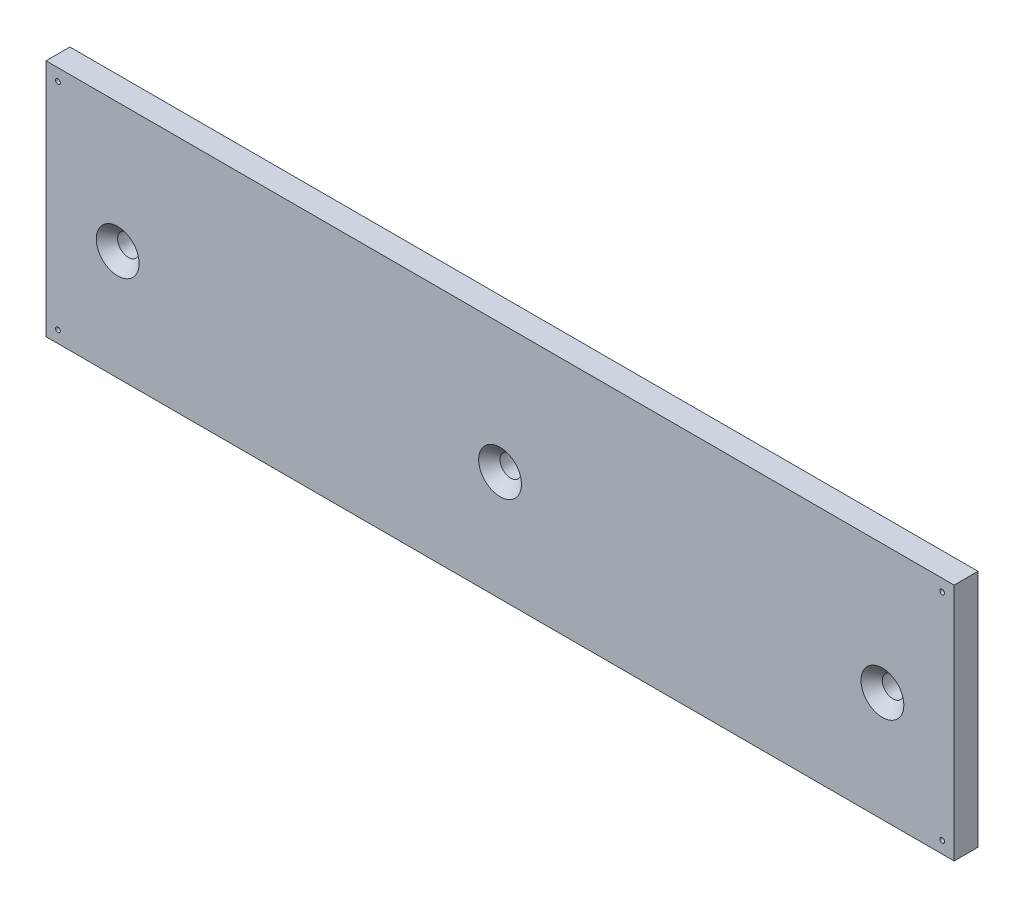
ISO-10303-21;
HEADER;
FILE_DESCRIPTION(('STEP AP214'),'2;1');
FILE_NAME('part.step','',(''),(''),'','','');
FILE_SCHEMA(('AUTOMOTIVE_DESIGN { 1 0 10303 214 1 1 1 1 }'));
ENDSEC;
DATA;
#1=APPLICATION_CONTEXT('core data for automotive mechanical design processes');
#2=APPLICATION_PROTOCOL_DEFINITION('international standard','automotive_design',2000,#1);
#3=PRODUCT_CONTEXT('',#1,'mechanical');
#4=PRODUCT('Part','Part','',(#3));
#5=PRODUCT_RELATED_PRODUCT_CATEGORY('part','',(#4));
#6=PRODUCT_DEFINITION_FORMATION('','',#4);
#7=PRODUCT_DEFINITION_CONTEXT('part definition',#1,'design');
#8=PRODUCT_DEFINITION('design','',#6,#7);
#9=PRODUCT_DEFINITION_SHAPE('','',#8);
#10=(LENGTH_UNIT() NAMED_UNIT(*) SI_UNIT(.MILLI.,.METRE.));
#11=(NAMED_UNIT(*) PLANE_ANGLE_UNIT() SI_UNIT($,.RADIAN.));
#12=(NAMED_UNIT(*) SI_UNIT($,.STERADIAN.) SOLID_ANGLE_UNIT());
#13=UNCERTAINTY_MEASURE_WITH_UNIT(LENGTH_MEASURE(1.E-05),#10,'distance_accuracy_value','');
#14=(GEOMETRIC_REPRESENTATION_CONTEXT(3) GLOBAL_UNCERTAINTY_ASSIGNED_CONTEXT((#13)) GLOBAL_UNIT_ASSIGNED_CONTEXT((#10,
#11,#12)) REPRESENTATION_CONTEXT('',''));
#15=CARTESIAN_POINT('',(0.,0.,0.));
#16=DIRECTION('',(0.,0.,1.));
#17=DIRECTION('',(1.,0.,0.));
#18=AXIS2_PLACEMENT_3D('',#15,#16,#17);
#19=CARTESIAN_POINT('',(0.,0.,5.));
#20=DIRECTION('',(0.,0.,-1.));
#21=DIRECTION('',(-1.,0.,0.));
#22=AXIS2_PLACEMENT_3D('',#19,#20,#21);
#23=PLANE('',#22);
#24=CARTESIAN_POINT('',(175.,23.,5.));
#25=DIRECTION('',(0.,0.,1.));
#26=DIRECTION('',(1.,0.,0.));
#27=AXIS2_PLACEMENT_3D('',#24,#25,#26);
#28=CIRCLE('',#27,4.48000000000001);
#29=CARTESIAN_POINT('',(179.48,23.,5.));
#30=VERTEX_POINT('',#29);
#31=EDGE_CURVE('E158',#30,#30,#28,.T.);
#32=ORIENTED_EDGE('',*,*,#31,.F.);
#33=EDGE_LOOP('',(#32));
#34=FACE_BOUND('',#33,.T.);
#35=CARTESIAN_POINT('',(15.,23.,5.));
#36=DIRECTION('',(0.,0.,1.));
#37=DIRECTION('',(1.,0.,0.));
#38=AXIS2_PLACEMENT_3D('',#35,#36,#37);
#39=CIRCLE('',#38,4.48);
#40=CARTESIAN_POINT('',(19.48,23.,5.));
#41=VERTEX_POINT('',#40);
#42=EDGE_CURVE('E149',#41,#41,#39,.T.);
#43=ORIENTED_EDGE('',*,*,#42,.F.);
#44=EDGE_LOOP('',(#43));
#45=FACE_BOUND('',#44,.T.);
#46=CARTESIAN_POINT('',(95.,23.,5.));
#47=DIRECTION('',(0.,0.,1.));
#48=DIRECTION('',(1.,0.,0.));
#49=AXIS2_PLACEMENT_3D('',#46,#47,#48);
#50=CIRCLE('',#49,4.48);
#51=CARTESIAN_POINT('',(99.48,23.,5.));
#52=VERTEX_POINT('',#51);
#53=EDGE_CURVE('E140',#52,#52,#50,.T.);
#54=ORIENTED_EDGE('',*,*,#53,.F.);
#55=EDGE_LOOP('',(#54));
#56=FACE_BOUND('',#55,.T.);
#57=CARTESIAN_POINT('',(2.5,2.5,5.));
#58=DIRECTION('',(0.,0.,1.));
#59=DIRECTION('',(1.,0.,0.));
#60=AXIS2_PLACEMENT_3D('',#57,#58,#59);
#61=CIRCLE('',#60,0.499999999999988);
#62=CARTESIAN_POINT('',(2.99999999999999,2.5,5.));
#63=VERTEX_POINT('',#62);
#64=EDGE_CURVE('E125',#63,#63,#61,.T.);
#65=ORIENTED_EDGE('',*,*,#64,.F.);
#66=EDGE_LOOP('',(#65));
#67=FACE_BOUND('',#66,.T.);
#68=CARTESIAN_POINT('',(187.5,2.5,5.));
#69=DIRECTION('',(0.,0.,1.));
#70=DIRECTION('',(1.,0.,0.));
#71=AXIS2_PLACEMENT_3D('',#68,#69,#70);
#72=CIRCLE('',#71,0.5);
#73=CARTESIAN_POINT('',(188.,2.5,5.));
#74=VERTEX_POINT('',#73);
#75=EDGE_CURVE('E119',#74,#74,#72,.T.);
#76=ORIENTED_EDGE('',*,*,#75,.F.);
#77=EDGE_LOOP('',(#76));
#78=FACE_BOUND('',#77,.T.);
#79=CARTESIAN_POINT('',(187.5,47.5,5.));
#80=DIRECTION('',(0.,0.,1.));
#81=DIRECTION('',(1.,0.,0.));
#82=AXIS2_PLACEMENT_3D('',#79,#80,#81);
#83=CIRCLE('',#82,0.5);
#84=CARTESIAN_POINT('',(188.,47.5,5.));
#85=VERTEX_POINT('',#84);
#86=EDGE_CURVE('E113',#85,#85,#83,.T.);
#87=ORIENTED_EDGE('',*,*,#86,.F.);
#88=EDGE_LOOP('',(#87));
#89=FACE_BOUND('',#88,.T.);
#90=DIRECTION('',(0.,-1.,0.));
#91=VECTOR('',#90,1.);
#92=CARTESIAN_POINT('',(0.,0.,5.));
#93=LINE('',#92,#91);
#94=CARTESIAN_POINT('',(0.,50.,5.));
#95=VERTEX_POINT('',#94);
#96=CARTESIAN_POINT('',(0.,0.,5.));
#97=VERTEX_POINT('',#96);
#98=EDGE_CURVE('E84',#95,#97,#93,.T.);
#99=ORIENTED_EDGE('',*,*,#98,.T.);
#100=DIRECTION('',(1.,0.,0.));
#101=VECTOR('',#100,1.);
#102=CARTESIAN_POINT('',(0.,0.,5.));
#103=LINE('',#102,#101);
#104=CARTESIAN_POINT('',(190.,0.,5.));
#105=VERTEX_POINT('',#104);
#106=EDGE_CURVE('E79',#97,#105,#103,.T.);
#107=ORIENTED_EDGE('',*,*,#106,.T.);
#108=DIRECTION('',(0.,1.,0.));
#109=VECTOR('',#108,1.);
#110=CARTESIAN_POINT('',(190.,0.,5.));
#111=LINE('',#110,#109);
#112=CARTESIAN_POINT('',(190.,50.,5.));
#113=VERTEX_POINT('',#112);
#114=EDGE_CURVE('E82',#105,#113,#111,.T.);
#115=ORIENTED_EDGE('',*,*,#114,.T.);
#116=DIRECTION('',(-1.,0.,0.));
#117=VECTOR('',#116,1.);
#118=CARTESIAN_POINT('',(0.,50.,5.));
#119=LINE('',#118,#117);
#120=EDGE_CURVE('E49',#113,#95,#119,.T.);
#121=ORIENTED_EDGE('',*,*,#120,.T.);
#122=EDGE_LOOP('',(#99,#107,#115,#121));
#123=FACE_BOUND('',#122,.T.);
#124=CARTESIAN_POINT('',(2.5,47.5,5.));
#125=DIRECTION('',(0.,0.,1.));
#126=DIRECTION('',(1.,0.,0.));
#127=AXIS2_PLACEMENT_3D('',#124,#125,#126);
#128=CIRCLE('',#127,0.499999999999988);
#129=CARTESIAN_POINT('',(2.99999999999999,47.5,5.));
#130=VERTEX_POINT('',#129);
#131=EDGE_CURVE('E131',#130,#130,#128,.T.);
#132=ORIENTED_EDGE('',*,*,#131,.F.);
#133=EDGE_LOOP('',(#132));
#134=FACE_BOUND('',#133,.T.);
#135=ADVANCED_FACE('F32',(#34,#45,#56,#67,#78,#89,#123,#134),#23,.F.);
#136=CARTESIAN_POINT('',(0.,0.,0.));
#137=DIRECTION('',(0.,0.,-1.));
#138=DIRECTION('',(-1.,0.,0.));
#139=AXIS2_PLACEMENT_3D('',#136,#137,#138);
#140=PLANE('',#139);
#141=CARTESIAN_POINT('',(175.,23.,0.));
#142=DIRECTION('',(0.,0.,1.));
#143=DIRECTION('',(1.,0.,0.));
#144=AXIS2_PLACEMENT_3D('',#141,#142,#143);
#145=CIRCLE('',#144,2.25);
#146=CARTESIAN_POINT('',(177.25,23.,0.));
#147=VERTEX_POINT('',#146);
#148=EDGE_CURVE('E152',#147,#147,#145,.T.);
#149=ORIENTED_EDGE('',*,*,#148,.T.);
#150=EDGE_LOOP('',(#149));
#151=FACE_BOUND('',#150,.T.);
#152=CARTESIAN_POINT('',(15.,23.,0.));
#153=DIRECTION('',(0.,0.,1.));
#154=DIRECTION('',(1.,0.,0.));
#155=AXIS2_PLACEMENT_3D('',#152,#153,#154);
#156=CIRCLE('',#155,2.25);
#157=CARTESIAN_POINT('',(17.25,23.,0.));
#158=VERTEX_POINT('',#157);
#159=EDGE_CURVE('E143',#158,#158,#156,.T.);
#160=ORIENTED_EDGE('',*,*,#159,.T.);
#161=EDGE_LOOP('',(#160));
#162=FACE_BOUND('',#161,.T.);
#163=CARTESIAN_POINT('',(95.,23.,0.));
#164=DIRECTION('',(0.,0.,1.));
#165=DIRECTION('',(1.,0.,0.));
#166=AXIS2_PLACEMENT_3D('',#163,#164,#165);
#167=CIRCLE('',#166,2.25);
#168=CARTESIAN_POINT('',(97.25,23.,0.));
#169=VERTEX_POINT('',#168);
#170=EDGE_CURVE('E134',#169,#169,#167,.T.);
#171=ORIENTED_EDGE('',*,*,#170,.T.);
#172=EDGE_LOOP('',(#171));
#173=FACE_BOUND('',#172,.T.);
#174=CARTESIAN_POINT('',(2.5,47.5,0.));
#175=DIRECTION('',(0.,0.,1.));
#176=DIRECTION('',(1.,0.,0.));
#177=AXIS2_PLACEMENT_3D('',#174,#175,#176);
#178=CIRCLE('',#177,0.499999999999998);
#179=CARTESIAN_POINT('',(3.,47.5,0.));
#180=VERTEX_POINT('',#179);
#181=EDGE_CURVE('E128',#180,#180,#178,.T.);
#182=ORIENTED_EDGE('',*,*,#181,.T.);
#183=EDGE_LOOP('',(#182));
#184=FACE_BOUND('',#183,.T.);
#185=DIRECTION('',(0.,-1.,0.));
#186=VECTOR('',#185,1.);
#187=CARTESIAN_POINT('',(0.,0.,0.));
#188=LINE('',#187,#186);
#189=CARTESIAN_POINT('',(0.,50.,0.));
#190=VERTEX_POINT('',#189);
#191=CARTESIAN_POINT('',(0.,0.,0.));
#192=VERTEX_POINT('',#191);
#193=EDGE_CURVE('E96',#190,#192,#188,.T.);
#194=ORIENTED_EDGE('',*,*,#193,.F.);
#195=DIRECTION('',(-1.,0.,0.));
#196=VECTOR('',#195,1.);
#197=CARTESIAN_POINT('',(0.,50.,0.));
#198=LINE('',#197,#196);
#199=CARTESIAN_POINT('',(190.,50.,0.));
#200=VERTEX_POINT('',#199);
#201=EDGE_CURVE('E72',#200,#190,#198,.T.);
#202=ORIENTED_EDGE('',*,*,#201,.F.);
#203=DIRECTION('',(0.,1.,0.));
#204=VECTOR('',#203,1.);
#205=CARTESIAN_POINT('',(190.,0.,0.));
#206=LINE('',#205,#204);
#207=CARTESIAN_POINT('',(190.,0.,0.));
#208=VERTEX_POINT('',#207);
#209=EDGE_CURVE('E66',#208,#200,#206,.T.);
#210=ORIENTED_EDGE('',*,*,#209,.F.);
#211=DIRECTION('',(1.,0.,0.));
#212=VECTOR('',#211,1.);
#213=CARTESIAN_POINT('',(0.,0.,0.));
#214=LINE('',#213,#212);
#215=EDGE_CURVE('E88',#192,#208,#214,.T.);
#216=ORIENTED_EDGE('',*,*,#215,.F.);
#217=EDGE_LOOP('',(#194,#202,#210,#216));
#218=FACE_BOUND('',#217,.T.);
#219=CARTESIAN_POINT('',(187.5,47.5,0.));
#220=DIRECTION('',(0.,0.,1.));
#221=DIRECTION('',(1.,0.,0.));
#222=AXIS2_PLACEMENT_3D('',#219,#220,#221);
#223=CIRCLE('',#222,0.5);
#224=CARTESIAN_POINT('',(188.,47.5,0.));
#225=VERTEX_POINT('',#224);
#226=EDGE_CURVE('E99',#225,#225,#223,.T.);
#227=ORIENTED_EDGE('',*,*,#226,.T.);
#228=EDGE_LOOP('',(#227));
#229=FACE_BOUND('',#228,.T.);
#230=CARTESIAN_POINT('',(187.5,2.5,0.));
#231=DIRECTION('',(0.,0.,1.));
#232=DIRECTION('',(1.,0.,0.));
#233=AXIS2_PLACEMENT_3D('',#230,#231,#232);
#234=CIRCLE('',#233,0.5);
#235=CARTESIAN_POINT('',(188.,2.5,0.));
#236=VERTEX_POINT('',#235);
#237=EDGE_CURVE('E116',#236,#236,#234,.T.);
#238=ORIENTED_EDGE('',*,*,#237,.T.);
#239=EDGE_LOOP('',(#238));
#240=FACE_BOUND('',#239,.T.);
#241=CARTESIAN_POINT('',(2.5,2.5,0.));
#242=DIRECTION('',(0.,0.,1.));
#243=DIRECTION('',(1.,0.,0.));
#244=AXIS2_PLACEMENT_3D('',#241,#242,#243);
#245=CIRCLE('',#244,0.499999999999998);
#246=CARTESIAN_POINT('',(3.,2.5,0.));
#247=VERTEX_POINT('',#246);
#248=EDGE_CURVE('E122',#247,#247,#245,.T.);
#249=ORIENTED_EDGE('',*,*,#248,.T.);
#250=EDGE_LOOP('',(#249));
#251=FACE_BOUND('',#250,.T.);
#252=ADVANCED_FACE('F107',(#151,#162,#173,#184,#218,#229,#240,#251),#140,.T.);
#253=CARTESIAN_POINT('',(0.,0.,5.));
#254=DIRECTION('',(1.,0.,0.));
#255=DIRECTION('',(0.,0.,-1.));
#256=AXIS2_PLACEMENT_3D('',#253,#254,#255);
#257=PLANE('',#256);
#258=ORIENTED_EDGE('',*,*,#193,.T.);
#259=DIRECTION('',(0.,0.,-1.));
#260=VECTOR('',#259,1.);
#261=CARTESIAN_POINT('',(0.,0.,5.));
#262=LINE('',#261,#260);
#263=EDGE_CURVE('E11',#97,#192,#262,.T.);
#264=ORIENTED_EDGE('',*,*,#263,.F.);
#265=ORIENTED_EDGE('',*,*,#98,.F.);
#266=DIRECTION('',(0.,0.,-1.));
#267=VECTOR('',#266,1.);
#268=CARTESIAN_POINT('',(0.,50.,5.));
#269=LINE('',#268,#267);
#270=EDGE_CURVE('E92',#95,#190,#269,.T.);
#271=ORIENTED_EDGE('',*,*,#270,.T.);
#272=EDGE_LOOP('',(#258,#264,#265,#271));
#273=FACE_BOUND('',#272,.T.);
#274=ADVANCED_FACE('F34',(#273),#257,.F.);
#275=CARTESIAN_POINT('',(0.,0.,5.));
#276=DIRECTION('',(0.,1.,0.));
#277=DIRECTION('',(0.,0.,1.));
#278=AXIS2_PLACEMENT_3D('',#275,#276,#277);
#279=PLANE('',#278);
#280=ORIENTED_EDGE('',*,*,#215,.T.);
#281=DIRECTION('',(0.,0.,-1.));
#282=VECTOR('',#281,1.);
#283=CARTESIAN_POINT('',(190.,0.,5.));
#284=LINE('',#283,#282);
#285=EDGE_CURVE('E41',#105,#208,#284,.T.);
#286=ORIENTED_EDGE('',*,*,#285,.F.);
#287=ORIENTED_EDGE('',*,*,#106,.F.);
#288=ORIENTED_EDGE('',*,*,#263,.T.);
#289=EDGE_LOOP('',(#280,#286,#287,#288));
#290=FACE_BOUND('',#289,.T.);
#291=ADVANCED_FACE('F87',(#290),#279,.F.);
#292=CARTESIAN_POINT('',(190.,0.,5.));
#293=DIRECTION('',(-1.,0.,0.));
#294=DIRECTION('',(0.,0.,1.));
#295=AXIS2_PLACEMENT_3D('',#292,#293,#294);
#296=PLANE('',#295);
#297=ORIENTED_EDGE('',*,*,#209,.T.);
#298=DIRECTION('',(0.,0.,-1.));
#299=VECTOR('',#298,1.);
#300=CARTESIAN_POINT('',(190.,50.,5.));
#301=LINE('',#300,#299);
#302=EDGE_CURVE('E89',#113,#200,#301,.T.);
#303=ORIENTED_EDGE('',*,*,#302,.F.);
#304=ORIENTED_EDGE('',*,*,#114,.F.);
#305=ORIENTED_EDGE('',*,*,#285,.T.);
#306=EDGE_LOOP('',(#297,#303,#304,#305));
#307=FACE_BOUND('',#306,.T.);
#308=ADVANCED_FACE('F90',(#307),#296,.F.);
#309=CARTESIAN_POINT('',(0.,50.,5.));
#310=DIRECTION('',(0.,-1.,0.));
#311=DIRECTION('',(0.,0.,-1.));
#312=AXIS2_PLACEMENT_3D('',#309,#310,#311);
#313=PLANE('',#312);
#314=ORIENTED_EDGE('',*,*,#201,.T.);
#315=ORIENTED_EDGE('',*,*,#270,.F.);
#316=ORIENTED_EDGE('',*,*,#120,.F.);
#317=ORIENTED_EDGE('',*,*,#302,.T.);
#318=EDGE_LOOP('',(#314,#315,#316,#317));
#319=FACE_BOUND('',#318,.T.);
#320=ADVANCED_FACE('F104',(#319),#313,.F.);
#321=CARTESIAN_POINT('',(187.5,47.5,5.));
#322=DIRECTION('',(0.,0.,1.));
#323=DIRECTION('',(1.,0.,0.));
#324=AXIS2_PLACEMENT_3D('',#321,#322,#323);
#325=CYLINDRICAL_SURFACE('',#324,0.5);
#326=ORIENTED_EDGE('',*,*,#226,.F.);
#327=EDGE_LOOP('',(#326));
#328=FACE_BOUND('',#327,.T.);
#329=ORIENTED_EDGE('',*,*,#86,.T.);
#330=EDGE_LOOP('',(#329));
#331=FACE_BOUND('',#330,.T.);
#332=ADVANCED_FACE('F177',(#328,#331),#325,.F.);
#333=CARTESIAN_POINT('',(187.5,2.5,5.));
#334=DIRECTION('',(0.,0.,1.));
#335=DIRECTION('',(1.,0.,0.));
#336=AXIS2_PLACEMENT_3D('',#333,#334,#335);
#337=CYLINDRICAL_SURFACE('',#336,0.5);
#338=ORIENTED_EDGE('',*,*,#237,.F.);
#339=EDGE_LOOP('',(#338));
#340=FACE_BOUND('',#339,.T.);
#341=ORIENTED_EDGE('',*,*,#75,.T.);
#342=EDGE_LOOP('',(#341));
#343=FACE_BOUND('',#342,.T.);
#344=ADVANCED_FACE('F179',(#340,#343),#337,.F.);
#345=CARTESIAN_POINT('',(2.5,2.5,5.));
#346=DIRECTION('',(0.,0.,1.));
#347=DIRECTION('',(1.,0.,0.));
#348=AXIS2_PLACEMENT_3D('',#345,#346,#347);
#349=CYLINDRICAL_SURFACE('',#348,0.499999999999993);
#350=ORIENTED_EDGE('',*,*,#248,.F.);
#351=EDGE_LOOP('',(#350));
#352=FACE_BOUND('',#351,.T.);
#353=ORIENTED_EDGE('',*,*,#64,.T.);
#354=EDGE_LOOP('',(#353));
#355=FACE_BOUND('',#354,.T.);
#356=ADVANCED_FACE('F186',(#352,#355),#349,.F.);
#357=CARTESIAN_POINT('',(2.5,47.5,5.));
#358=DIRECTION('',(0.,0.,1.));
#359=DIRECTION('',(1.,0.,0.));
#360=AXIS2_PLACEMENT_3D('',#357,#358,#359);
#361=CYLINDRICAL_SURFACE('',#360,0.499999999999993);
#362=ORIENTED_EDGE('',*,*,#181,.F.);
#363=EDGE_LOOP('',(#362));
#364=FACE_BOUND('',#363,.T.);
#365=ORIENTED_EDGE('',*,*,#131,.T.);
#366=EDGE_LOOP('',(#365));
#367=FACE_BOUND('',#366,.T.);
#368=ADVANCED_FACE('F256',(#364,#367),#361,.F.);
#369=CARTESIAN_POINT('',(95.,23.,5.));
#370=DIRECTION('',(0.,0.,1.));
#371=DIRECTION('',(1.,0.,0.));
#372=AXIS2_PLACEMENT_3D('',#369,#370,#371);
#373=CYLINDRICAL_SURFACE('',#372,2.25);
#374=ORIENTED_EDGE('',*,*,#170,.F.);
#375=EDGE_LOOP('',(#374));
#376=FACE_BOUND('',#375,.T.);
#377=CARTESIAN_POINT('',(95.,23.,2.76999999999999));
#378=DIRECTION('',(0.,0.,1.));
#379=DIRECTION('',(1.,0.,0.));
#380=AXIS2_PLACEMENT_3D('',#377,#378,#379);
#381=CIRCLE('',#380,2.24999999999999);
#382=CARTESIAN_POINT('',(97.25,23.,2.76999999999999));
#383=VERTEX_POINT('',#382);
#384=EDGE_CURVE('E137',#383,#383,#381,.T.);
#385=ORIENTED_EDGE('',*,*,#384,.T.);
#386=EDGE_LOOP('',(#385));
#387=FACE_BOUND('',#386,.T.);
#388=ADVANCED_FACE('F246',(#376,#387),#373,.F.);
#389=CARTESIAN_POINT('',(95.,23.,5.));
#390=DIRECTION('',(0.,0.,1.));
#391=DIRECTION('',(1.,0.,0.));
#392=AXIS2_PLACEMENT_3D('',#389,#390,#391);
#393=CONICAL_SURFACE('',#392,4.48,0.785398163397448);
#394=ORIENTED_EDGE('',*,*,#384,.F.);
#395=EDGE_LOOP('',(#394));
#396=FACE_BOUND('',#395,.T.);
#397=ORIENTED_EDGE('',*,*,#53,.T.);
#398=EDGE_LOOP('',(#397));
#399=FACE_BOUND('',#398,.T.);
#400=ADVANCED_FACE('F236',(#396,#399),#393,.F.);
#401=CARTESIAN_POINT('',(15.,23.,5.));
#402=DIRECTION('',(0.,0.,1.));
#403=DIRECTION('',(1.,0.,0.));
#404=AXIS2_PLACEMENT_3D('',#401,#402,#403);
#405=CYLINDRICAL_SURFACE('',#404,2.24999999999999);
#406=ORIENTED_EDGE('',*,*,#159,.F.);
#407=EDGE_LOOP('',(#406));
#408=FACE_BOUND('',#407,.T.);
#409=CARTESIAN_POINT('',(15.,23.,2.76999999999999));
#410=DIRECTION('',(0.,0.,1.));
#411=DIRECTION('',(1.,0.,0.));
#412=AXIS2_PLACEMENT_3D('',#409,#410,#411);
#413=CIRCLE('',#412,2.24999999999999);
#414=CARTESIAN_POINT('',(17.25,23.,2.76999999999999));
#415=VERTEX_POINT('',#414);
#416=EDGE_CURVE('E146',#415,#415,#413,.T.);
#417=ORIENTED_EDGE('',*,*,#416,.T.);
#418=EDGE_LOOP('',(#417));
#419=FACE_BOUND('',#418,.T.);
#420=ADVANCED_FACE('F224',(#408,#419),#405,.F.);
#421=CARTESIAN_POINT('',(15.,23.,5.));
#422=DIRECTION('',(0.,0.,1.));
#423=DIRECTION('',(1.,0.,0.));
#424=AXIS2_PLACEMENT_3D('',#421,#422,#423);
#425=CONICAL_SURFACE('',#424,4.48,0.785398163397449);
#426=ORIENTED_EDGE('',*,*,#416,.F.);
#427=EDGE_LOOP('',(#426));
#428=FACE_BOUND('',#427,.T.);
#429=ORIENTED_EDGE('',*,*,#42,.T.);
#430=EDGE_LOOP('',(#429));
#431=FACE_BOUND('',#430,.T.);
#432=ADVANCED_FACE('F218',(#428,#431),#425,.F.);
#433=CARTESIAN_POINT('',(175.,23.,5.));
#434=DIRECTION('',(0.,0.,1.));
#435=DIRECTION('',(1.,0.,0.));
#436=AXIS2_PLACEMENT_3D('',#433,#434,#435);
#437=CYLINDRICAL_SURFACE('',#436,2.24999999999999);
#438=ORIENTED_EDGE('',*,*,#148,.F.);
#439=EDGE_LOOP('',(#438));
#440=FACE_BOUND('',#439,.T.);
#441=CARTESIAN_POINT('',(175.,23.,2.76999999999999));
#442=DIRECTION('',(0.,0.,1.));
#443=DIRECTION('',(1.,0.,0.));
#444=AXIS2_PLACEMENT_3D('',#441,#442,#443);
#445=CIRCLE('',#444,2.24999999999997);
#446=CARTESIAN_POINT('',(177.25,23.,2.76999999999999));
#447=VERTEX_POINT('',#446);
#448=EDGE_CURVE('E155',#447,#447,#445,.T.);
#449=ORIENTED_EDGE('',*,*,#448,.T.);
#450=EDGE_LOOP('',(#449));
#451=FACE_BOUND('',#450,.T.);
#452=ADVANCED_FACE('F223',(#440,#451),#437,.F.);
#453=CARTESIAN_POINT('',(175.,23.,5.));
#454=DIRECTION('',(0.,0.,1.));
#455=DIRECTION('',(1.,0.,0.));
#456=AXIS2_PLACEMENT_3D('',#453,#454,#455);
#457=CONICAL_SURFACE('',#456,4.48000000000001,0.785398163397454);
#458=ORIENTED_EDGE('',*,*,#448,.F.);
#459=EDGE_LOOP('',(#458));
#460=FACE_BOUND('',#459,.T.);
#461=ORIENTED_EDGE('',*,*,#31,.T.);
#462=EDGE_LOOP('',(#461));
#463=FACE_BOUND('',#462,.T.);
#464=ADVANCED_FACE('F162',(#460,#463),#457,.F.);
#465=CLOSED_SHELL('',(#135,#252,#274,#291,#308,#320,#332,#344,#356,#368,#388,#400,#420,#432,
#452,#464));
#466=MANIFOLD_SOLID_BREP('B2',#465);
#467=ADVANCED_BREP_SHAPE_REPRESENTATION('',(#18,#466),#14);
#468=SHAPE_DEFINITION_REPRESENTATION(#9,#467);
ENDSEC;
END-ISO-10303-21;
